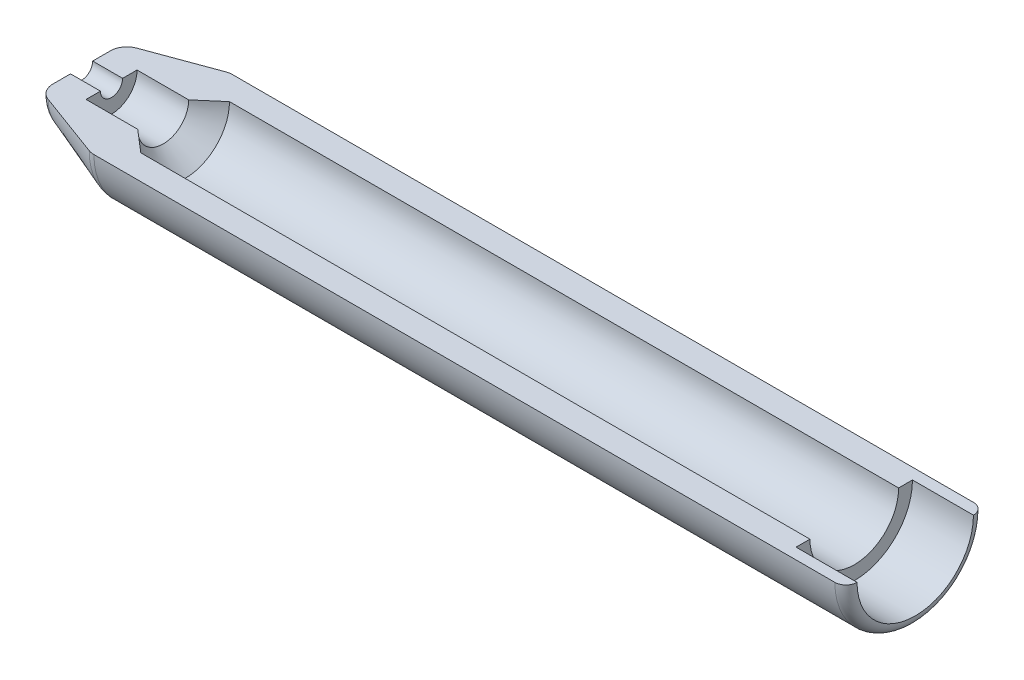
ISO-10303-21;
HEADER;
FILE_DESCRIPTION(('STEP AP214'),'2;1');
FILE_NAME('part.step','',(''),(''),'','','');
FILE_SCHEMA(('AUTOMOTIVE_DESIGN { 1 0 10303 214 1 1 1 1 }'));
ENDSEC;
DATA;
#1=APPLICATION_CONTEXT('core data for automotive mechanical design processes');
#2=APPLICATION_PROTOCOL_DEFINITION('international standard','automotive_design',2000,#1);
#3=PRODUCT_CONTEXT('',#1,'mechanical');
#4=PRODUCT('Part','Part','',(#3));
#5=PRODUCT_RELATED_PRODUCT_CATEGORY('part','',(#4));
#6=PRODUCT_DEFINITION_FORMATION('','',#4);
#7=PRODUCT_DEFINITION_CONTEXT('part definition',#1,'design');
#8=PRODUCT_DEFINITION('design','',#6,#7);
#9=PRODUCT_DEFINITION_SHAPE('','',#8);
#10=(LENGTH_UNIT() NAMED_UNIT(*) SI_UNIT(.MILLI.,.METRE.));
#11=(NAMED_UNIT(*) PLANE_ANGLE_UNIT() SI_UNIT($,.RADIAN.));
#12=(NAMED_UNIT(*) SI_UNIT($,.STERADIAN.) SOLID_ANGLE_UNIT());
#13=UNCERTAINTY_MEASURE_WITH_UNIT(LENGTH_MEASURE(1.E-05),#10,'distance_accuracy_value','');
#14=(GEOMETRIC_REPRESENTATION_CONTEXT(3) GLOBAL_UNCERTAINTY_ASSIGNED_CONTEXT((#13)) GLOBAL_UNIT_ASSIGNED_CONTEXT((#10,
#11,#12)) REPRESENTATION_CONTEXT('',''));
#15=CARTESIAN_POINT('',(0.,0.,0.));
#16=DIRECTION('',(0.,0.,1.));
#17=DIRECTION('',(1.,0.,0.));
#18=AXIS2_PLACEMENT_3D('',#15,#16,#17);
#19=CARTESIAN_POINT('',(-2.32246740661106,0.,-0.100000000000268));
#20=DIRECTION('',(1.,0.,0.));
#21=DIRECTION('',(0.,0.,-1.));
#22=AXIS2_PLACEMENT_3D('',#19,#20,#21);
#23=TOROIDAL_SURFACE('',#22,0.518463927586876,0.3);
#24=CARTESIAN_POINT('',(-2.62246740661106,0.,-0.100000000000268));
#25=DIRECTION('',(1.,0.,0.));
#26=DIRECTION('',(0.,0.,-1.));
#27=AXIS2_PLACEMENT_3D('',#24,#25,#26);
#28=CIRCLE('',#27,0.518463927586876);
#29=CARTESIAN_POINT('',(-2.62246740661106,0.,0.418463927586608));
#30=VERTEX_POINT('',#29);
#31=CARTESIAN_POINT('',(-2.62246740661106,0.,-0.618463927587144));
#32=VERTEX_POINT('',#31);
#33=EDGE_CURVE('E11',#30,#32,#28,.T.);
#34=ORIENTED_EDGE('',*,*,#33,.T.);
#35=CARTESIAN_POINT('',(-2.32246740661106,0.,-0.618463927587144));
#36=DIRECTION('',(0.,1.,0.));
#37=DIRECTION('',(0.,0.,1.));
#38=AXIS2_PLACEMENT_3D('',#35,#36,#37);
#39=CIRCLE('',#38,0.3);
#40=CARTESIAN_POINT('',(-2.42608902564006,0.,-0.900000000000268));
#41=VERTEX_POINT('',#40);
#42=EDGE_CURVE('E126',#41,#32,#39,.T.);
#43=ORIENTED_EDGE('',*,*,#42,.F.);
#44=CARTESIAN_POINT('',(-2.42608902564006,0.,-0.100000000000268));
#45=DIRECTION('',(1.,0.,0.));
#46=DIRECTION('',(0.,0.,-1.));
#47=AXIS2_PLACEMENT_3D('',#44,#45,#46);
#48=CIRCLE('',#47,0.8);
#49=CARTESIAN_POINT('',(-2.42608902564006,0.,0.699999999999732));
#50=VERTEX_POINT('',#49);
#51=EDGE_CURVE('E47',#50,#41,#48,.T.);
#52=ORIENTED_EDGE('',*,*,#51,.F.);
#53=CARTESIAN_POINT('',(-2.32246740661106,0.,0.418463927586608));
#54=DIRECTION('',(0.,-1.,0.));
#55=DIRECTION('',(0.,0.,-1.));
#56=AXIS2_PLACEMENT_3D('',#53,#54,#55);
#57=CIRCLE('',#56,0.3);
#58=EDGE_CURVE('E128',#50,#30,#57,.T.);
#59=ORIENTED_EDGE('',*,*,#58,.T.);
#60=EDGE_LOOP('',(#34,#43,#52,#59));
#61=FACE_BOUND('',#60,.T.);
#62=ADVANCED_FACE('F32',(#61),#23,.T.);
#63=CARTESIAN_POINT('',(-2.62246740661106,0.,0.418463927586608));
#64=DIRECTION('',(-1.,0.,0.));
#65=DIRECTION('',(0.,0.,1.));
#66=AXIS2_PLACEMENT_3D('',#63,#64,#65);
#67=PLANE('',#66);
#68=CARTESIAN_POINT('',(-2.62246740661106,0.,-0.100000000000268));
#69=DIRECTION('',(1.,0.,0.));
#70=DIRECTION('',(0.,0.,-1.));
#71=AXIS2_PLACEMENT_3D('',#68,#69,#70);
#72=CIRCLE('',#71,0.2);
#73=CARTESIAN_POINT('',(-2.62246740661106,0.,0.099999999999732));
#74=VERTEX_POINT('',#73);
#75=CARTESIAN_POINT('',(-2.62246740661106,0.,-0.300000000000268));
#76=VERTEX_POINT('',#75);
#77=EDGE_CURVE('E40',#74,#76,#72,.T.);
#78=ORIENTED_EDGE('',*,*,#77,.T.);
#79=DIRECTION('',(0.,0.,1.));
#80=VECTOR('',#79,1.);
#81=CARTESIAN_POINT('',(-2.62246740661106,0.,-0.618463927587144));
#82=LINE('',#81,#80);
#83=EDGE_CURVE('E137',#32,#76,#82,.T.);
#84=ORIENTED_EDGE('',*,*,#83,.F.);
#85=ORIENTED_EDGE('',*,*,#33,.F.);
#86=DIRECTION('',(0.,0.,-1.));
#87=VECTOR('',#86,1.);
#88=CARTESIAN_POINT('',(-2.62246740661106,0.,0.418463927586608));
#89=LINE('',#88,#87);
#90=EDGE_CURVE('E173',#30,#74,#89,.T.);
#91=ORIENTED_EDGE('',*,*,#90,.T.);
#92=EDGE_LOOP('',(#78,#84,#85,#91));
#93=FACE_BOUND('',#92,.T.);
#94=ADVANCED_FACE('F34',(#93),#67,.T.);
#95=CARTESIAN_POINT('',(-3.18503295530929,0.,-0.100000000000268));
#96=DIRECTION('',(1.,0.,0.));
#97=DIRECTION('',(0.,0.,-1.));
#98=AXIS2_PLACEMENT_3D('',#95,#96,#97);
#99=CYLINDRICAL_SURFACE('',#98,0.2);
#100=CARTESIAN_POINT('',(-2.08239037192044,0.,-0.100000000000268));
#101=DIRECTION('',(1.,0.,0.));
#102=DIRECTION('',(0.,0.,-1.));
#103=AXIS2_PLACEMENT_3D('',#100,#101,#102);
#104=CIRCLE('',#103,0.2);
#105=CARTESIAN_POINT('',(-2.08239037192044,0.,0.099999999999732));
#106=VERTEX_POINT('',#105);
#107=CARTESIAN_POINT('',(-2.08239037192044,0.,-0.300000000000268));
#108=VERTEX_POINT('',#107);
#109=EDGE_CURVE('E224',#106,#108,#104,.T.);
#110=ORIENTED_EDGE('',*,*,#109,.T.);
#111=DIRECTION('',(1.,0.,0.));
#112=VECTOR('',#111,1.);
#113=CARTESIAN_POINT('',(-2.08239037192044,0.,-0.300000000000268));
#114=LINE('',#113,#112);
#115=EDGE_CURVE('E142',#76,#108,#114,.T.);
#116=ORIENTED_EDGE('',*,*,#115,.F.);
#117=ORIENTED_EDGE('',*,*,#77,.F.);
#118=DIRECTION('',(1.,0.,0.));
#119=VECTOR('',#118,1.);
#120=CARTESIAN_POINT('',(-2.08239037192044,0.,0.099999999999732));
#121=LINE('',#120,#119);
#122=EDGE_CURVE('E175',#74,#106,#121,.T.);
#123=ORIENTED_EDGE('',*,*,#122,.T.);
#124=EDGE_LOOP('',(#110,#116,#117,#123));
#125=FACE_BOUND('',#124,.T.);
#126=ADVANCED_FACE('F226',(#125),#99,.F.);
#127=CARTESIAN_POINT('',(-2.08239037192044,0.,0.099999999999732));
#128=DIRECTION('',(1.,0.,0.));
#129=DIRECTION('',(0.,0.,-1.));
#130=AXIS2_PLACEMENT_3D('',#127,#128,#129);
#131=PLANE('',#130);
#132=CARTESIAN_POINT('',(-2.08239037192044,0.,-0.100000000000268));
#133=DIRECTION('',(1.,0.,0.));
#134=DIRECTION('',(0.,0.,-1.));
#135=AXIS2_PLACEMENT_3D('',#132,#133,#134);
#136=CIRCLE('',#135,0.46);
#137=CARTESIAN_POINT('',(-2.08239037192044,0.,0.359999999999732));
#138=VERTEX_POINT('',#137);
#139=CARTESIAN_POINT('',(-2.08239037192044,0.,-0.560000000000268));
#140=VERTEX_POINT('',#139);
#141=EDGE_CURVE('E222',#138,#140,#136,.T.);
#142=ORIENTED_EDGE('',*,*,#141,.T.);
#143=DIRECTION('',(0.,0.,-1.));
#144=VECTOR('',#143,1.);
#145=CARTESIAN_POINT('',(-2.08239037192044,0.,-0.300000000000268));
#146=LINE('',#145,#144);
#147=EDGE_CURVE('E144',#108,#140,#146,.T.);
#148=ORIENTED_EDGE('',*,*,#147,.F.);
#149=ORIENTED_EDGE('',*,*,#109,.F.);
#150=DIRECTION('',(0.,0.,1.));
#151=VECTOR('',#150,1.);
#152=CARTESIAN_POINT('',(-2.08239037192044,0.,0.099999999999732));
#153=LINE('',#152,#151);
#154=EDGE_CURVE('E178',#106,#138,#153,.T.);
#155=ORIENTED_EDGE('',*,*,#154,.T.);
#156=EDGE_LOOP('',(#142,#148,#149,#155));
#157=FACE_BOUND('',#156,.T.);
#158=ADVANCED_FACE('F232',(#157),#131,.T.);
#159=CARTESIAN_POINT('',(-3.18503295530929,0.,-0.100000000000268));
#160=DIRECTION('',(1.,0.,0.));
#161=DIRECTION('',(0.,0.,-1.));
#162=AXIS2_PLACEMENT_3D('',#159,#160,#161);
#163=CYLINDRICAL_SURFACE('',#162,0.46);
#164=CARTESIAN_POINT('',(-1.15,0.,-0.100000000000268));
#165=DIRECTION('',(1.,0.,0.));
#166=DIRECTION('',(0.,0.,-1.));
#167=AXIS2_PLACEMENT_3D('',#164,#165,#166);
#168=CIRCLE('',#167,0.46);
#169=CARTESIAN_POINT('',(-1.15,0.,0.359999999999732));
#170=VERTEX_POINT('',#169);
#171=CARTESIAN_POINT('',(-1.15,0.,-0.560000000000268));
#172=VERTEX_POINT('',#171);
#173=EDGE_CURVE('E220',#170,#172,#168,.T.);
#174=ORIENTED_EDGE('',*,*,#173,.T.);
#175=DIRECTION('',(1.,0.,0.));
#176=VECTOR('',#175,1.);
#177=CARTESIAN_POINT('',(-2.08239037192044,0.,-0.560000000000268));
#178=LINE('',#177,#176);
#179=EDGE_CURVE('E149',#140,#172,#178,.T.);
#180=ORIENTED_EDGE('',*,*,#179,.F.);
#181=ORIENTED_EDGE('',*,*,#141,.F.);
#182=DIRECTION('',(1.,0.,0.));
#183=VECTOR('',#182,1.);
#184=CARTESIAN_POINT('',(-2.08239037192044,0.,0.359999999999732));
#185=LINE('',#184,#183);
#186=EDGE_CURVE('E181',#138,#170,#185,.T.);
#187=ORIENTED_EDGE('',*,*,#186,.T.);
#188=EDGE_LOOP('',(#174,#180,#181,#187));
#189=FACE_BOUND('',#188,.T.);
#190=ADVANCED_FACE('F235',(#189),#163,.F.);
#191=CARTESIAN_POINT('',(-1.15,0.,-0.100000000000268));
#192=DIRECTION('',(1.,0.,0.));
#193=DIRECTION('',(0.,0.,-1.));
#194=AXIS2_PLACEMENT_3D('',#191,#192,#193);
#195=CONICAL_SURFACE('',#194,0.46,0.710018612411804);
#196=CARTESIAN_POINT('',(-0.754449261183806,0.,-0.100000000000268));
#197=DIRECTION('',(1.,0.,0.));
#198=DIRECTION('',(0.,0.,-1.));
#199=AXIS2_PLACEMENT_3D('',#196,#197,#198);
#200=CIRCLE('',#199,0.8);
#201=CARTESIAN_POINT('',(-0.754449261183806,0.,0.699999999999733));
#202=VERTEX_POINT('',#201);
#203=CARTESIAN_POINT('',(-0.754449261183806,0.,-0.900000000000268));
#204=VERTEX_POINT('',#203);
#205=EDGE_CURVE('E218',#202,#204,#200,.T.);
#206=ORIENTED_EDGE('',*,*,#205,.T.);
#207=DIRECTION('',(0.758349743660579,0.,-0.651847885852163));
#208=VECTOR('',#207,1.);
#209=CARTESIAN_POINT('',(-1.15,0.,-0.560000000000268));
#210=LINE('',#209,#208);
#211=EDGE_CURVE('E152',#172,#204,#210,.T.);
#212=ORIENTED_EDGE('',*,*,#211,.F.);
#213=ORIENTED_EDGE('',*,*,#173,.F.);
#214=DIRECTION('',(0.758349743660579,0.,0.651847885852163));
#215=VECTOR('',#214,1.);
#216=CARTESIAN_POINT('',(-1.15,0.,0.359999999999732));
#217=LINE('',#216,#215);
#218=EDGE_CURVE('E184',#170,#202,#217,.T.);
#219=ORIENTED_EDGE('',*,*,#218,.T.);
#220=EDGE_LOOP('',(#206,#212,#213,#219));
#221=FACE_BOUND('',#220,.T.);
#222=ADVANCED_FACE('F240',(#221),#195,.F.);
#223=CARTESIAN_POINT('',(-3.18503295530929,0.,-0.100000000000268));
#224=DIRECTION('',(1.,0.,0.));
#225=DIRECTION('',(0.,0.,-1.));
#226=AXIS2_PLACEMENT_3D('',#223,#224,#225);
#227=CYLINDRICAL_SURFACE('',#226,0.800000000000001);
#228=CARTESIAN_POINT('',(11.3176096280796,0.,-0.100000000000268));
#229=DIRECTION('',(1.,0.,0.));
#230=DIRECTION('',(0.,0.,-1.));
#231=AXIS2_PLACEMENT_3D('',#228,#229,#230);
#232=CIRCLE('',#231,0.800000000000001);
#233=CARTESIAN_POINT('',(11.3176096280796,0.,0.699999999999733));
#234=VERTEX_POINT('',#233);
#235=CARTESIAN_POINT('',(11.3176096280796,0.,-0.900000000000269));
#236=VERTEX_POINT('',#235);
#237=EDGE_CURVE('E215',#234,#236,#232,.T.);
#238=ORIENTED_EDGE('',*,*,#237,.T.);
#239=DIRECTION('',(1.,0.,0.));
#240=VECTOR('',#239,1.);
#241=CARTESIAN_POINT('',(-0.754449261183806,0.,-0.900000000000268));
#242=LINE('',#241,#240);
#243=EDGE_CURVE('E155',#204,#236,#242,.T.);
#244=ORIENTED_EDGE('',*,*,#243,.F.);
#245=ORIENTED_EDGE('',*,*,#205,.F.);
#246=DIRECTION('',(1.,0.,0.));
#247=VECTOR('',#246,1.);
#248=CARTESIAN_POINT('',(-0.754449261183806,0.,0.699999999999733));
#249=LINE('',#248,#247);
#250=EDGE_CURVE('E187',#202,#234,#249,.T.);
#251=ORIENTED_EDGE('',*,*,#250,.T.);
#252=EDGE_LOOP('',(#238,#244,#245,#251));
#253=FACE_BOUND('',#252,.T.);
#254=ADVANCED_FACE('F243',(#253),#227,.F.);
#255=CARTESIAN_POINT('',(11.3176096280796,0.,0.949999999999733));
#256=DIRECTION('',(1.,0.,0.));
#257=DIRECTION('',(0.,0.,-1.));
#258=AXIS2_PLACEMENT_3D('',#255,#256,#257);
#259=PLANE('',#258);
#260=CARTESIAN_POINT('',(11.3176096280796,0.,-0.100000000000268));
#261=DIRECTION('',(1.,0.,0.));
#262=DIRECTION('',(0.,0.,-1.));
#263=AXIS2_PLACEMENT_3D('',#260,#261,#262);
#264=CIRCLE('',#263,1.05);
#265=CARTESIAN_POINT('',(11.3176096280796,0.,0.949999999999733));
#266=VERTEX_POINT('',#265);
#267=CARTESIAN_POINT('',(11.3176096280796,0.,-1.15000000000027));
#268=VERTEX_POINT('',#267);
#269=EDGE_CURVE('E213',#266,#268,#264,.T.);
#270=ORIENTED_EDGE('',*,*,#269,.T.);
#271=DIRECTION('',(0.,0.,-1.));
#272=VECTOR('',#271,1.);
#273=CARTESIAN_POINT('',(11.3176096280796,0.,-1.15000000000027));
#274=LINE('',#273,#272);
#275=EDGE_CURVE('E157',#236,#268,#274,.T.);
#276=ORIENTED_EDGE('',*,*,#275,.F.);
#277=ORIENTED_EDGE('',*,*,#237,.F.);
#278=DIRECTION('',(0.,0.,1.));
#279=VECTOR('',#278,1.);
#280=CARTESIAN_POINT('',(11.3176096280796,0.,0.949999999999733));
#281=LINE('',#280,#279);
#282=EDGE_CURVE('E189',#234,#266,#281,.T.);
#283=ORIENTED_EDGE('',*,*,#282,.T.);
#284=EDGE_LOOP('',(#270,#276,#277,#283));
#285=FACE_BOUND('',#284,.T.);
#286=ADVANCED_FACE('F268',(#285),#259,.T.);
#287=CARTESIAN_POINT('',(-3.18503295530929,0.,-0.100000000000268));
#288=DIRECTION('',(1.,0.,0.));
#289=DIRECTION('',(0.,0.,-1.));
#290=AXIS2_PLACEMENT_3D('',#287,#288,#289);
#291=CYLINDRICAL_SURFACE('',#290,1.05);
#292=CARTESIAN_POINT('',(12.4176096280796,0.,-0.100000000000268));
#293=DIRECTION('',(1.,0.,0.));
#294=DIRECTION('',(0.,0.,-1.));
#295=AXIS2_PLACEMENT_3D('',#292,#293,#294);
#296=CIRCLE('',#295,1.05);
#297=CARTESIAN_POINT('',(12.4176096280796,0.,0.949999999999733));
#298=VERTEX_POINT('',#297);
#299=CARTESIAN_POINT('',(12.4176096280796,0.,-1.15000000000027));
#300=VERTEX_POINT('',#299);
#301=EDGE_CURVE('E211',#298,#300,#296,.T.);
#302=ORIENTED_EDGE('',*,*,#301,.T.);
#303=DIRECTION('',(1.,0.,0.));
#304=VECTOR('',#303,1.);
#305=CARTESIAN_POINT('',(12.4176096280796,0.,-1.15000000000027));
#306=LINE('',#305,#304);
#307=EDGE_CURVE('E160',#268,#300,#306,.T.);
#308=ORIENTED_EDGE('',*,*,#307,.F.);
#309=ORIENTED_EDGE('',*,*,#269,.F.);
#310=DIRECTION('',(1.,0.,0.));
#311=VECTOR('',#310,1.);
#312=CARTESIAN_POINT('',(12.4176096280796,0.,0.949999999999733));
#313=LINE('',#312,#311);
#314=EDGE_CURVE('E192',#266,#298,#313,.T.);
#315=ORIENTED_EDGE('',*,*,#314,.T.);
#316=EDGE_LOOP('',(#302,#308,#309,#315));
#317=FACE_BOUND('',#316,.T.);
#318=ADVANCED_FACE('F250',(#317),#291,.F.);
#319=CARTESIAN_POINT('',(12.2176096280796,0.,-0.100000000000268));
#320=DIRECTION('',(1.,0.,0.));
#321=DIRECTION('',(0.,0.,-1.));
#322=AXIS2_PLACEMENT_3D('',#319,#320,#321);
#323=TOROIDAL_SURFACE('',#322,1.05,0.2);
#324=CARTESIAN_POINT('',(12.2176096280796,0.,-0.100000000000268));
#325=DIRECTION('',(1.,0.,0.));
#326=DIRECTION('',(0.,0.,-1.));
#327=AXIS2_PLACEMENT_3D('',#324,#325,#326);
#328=CIRCLE('',#327,1.25);
#329=CARTESIAN_POINT('',(12.2176096280796,0.,1.14999999999973));
#330=VERTEX_POINT('',#329);
#331=CARTESIAN_POINT('',(12.2176096280796,0.,-1.35000000000027));
#332=VERTEX_POINT('',#331);
#333=EDGE_CURVE('E209',#330,#332,#328,.T.);
#334=ORIENTED_EDGE('',*,*,#333,.T.);
#335=CARTESIAN_POINT('',(12.2176096280796,0.,-1.15000000000027));
#336=DIRECTION('',(0.,1.,0.));
#337=DIRECTION('',(0.,0.,-1.));
#338=AXIS2_PLACEMENT_3D('',#335,#336,#337);
#339=CIRCLE('',#338,0.2);
#340=EDGE_CURVE('E163',#300,#332,#339,.T.);
#341=ORIENTED_EDGE('',*,*,#340,.F.);
#342=ORIENTED_EDGE('',*,*,#301,.F.);
#343=CARTESIAN_POINT('',(12.2176096280796,0.,0.949999999999732));
#344=DIRECTION('',(0.,-1.,0.));
#345=DIRECTION('',(0.,0.,1.));
#346=AXIS2_PLACEMENT_3D('',#343,#344,#345);
#347=CIRCLE('',#346,0.2);
#348=EDGE_CURVE('E195',#298,#330,#347,.T.);
#349=ORIENTED_EDGE('',*,*,#348,.T.);
#350=EDGE_LOOP('',(#334,#341,#342,#349));
#351=FACE_BOUND('',#350,.T.);
#352=ADVANCED_FACE('F254',(#351),#323,.T.);
#353=CARTESIAN_POINT('',(-3.18503295530929,0.,-0.100000000000268));
#354=DIRECTION('',(1.,0.,0.));
#355=DIRECTION('',(0.,0.,-1.));
#356=AXIS2_PLACEMENT_3D('',#353,#354,#355);
#357=CYLINDRICAL_SURFACE('',#356,1.25);
#358=CARTESIAN_POINT('',(-1.15,0.,-0.100000000000268));
#359=DIRECTION('',(1.,0.,0.));
#360=DIRECTION('',(0.,0.,-1.));
#361=AXIS2_PLACEMENT_3D('',#358,#359,#360);
#362=CIRCLE('',#361,1.25);
#363=CARTESIAN_POINT('',(-1.15,0.,1.14999999999973));
#364=VERTEX_POINT('',#363);
#365=CARTESIAN_POINT('',(-1.15,0.,-1.35000000000027));
#366=VERTEX_POINT('',#365);
#367=EDGE_CURVE('E207',#364,#366,#362,.T.);
#368=ORIENTED_EDGE('',*,*,#367,.T.);
#369=DIRECTION('',(-1.,0.,0.));
#370=VECTOR('',#369,1.);
#371=CARTESIAN_POINT('',(12.2176096280796,0.,-1.35000000000027));
#372=LINE('',#371,#370);
#373=EDGE_CURVE('E166',#332,#366,#372,.T.);
#374=ORIENTED_EDGE('',*,*,#373,.F.);
#375=ORIENTED_EDGE('',*,*,#333,.F.);
#376=DIRECTION('',(-1.,0.,0.));
#377=VECTOR('',#376,1.);
#378=CARTESIAN_POINT('',(12.2176096280796,0.,1.14999999999973));
#379=LINE('',#378,#377);
#380=EDGE_CURVE('E198',#330,#364,#379,.T.);
#381=ORIENTED_EDGE('',*,*,#380,.T.);
#382=EDGE_LOOP('',(#368,#374,#375,#381));
#383=FACE_BOUND('',#382,.T.);
#384=ADVANCED_FACE('F259',(#383),#357,.T.);
#385=CARTESIAN_POINT('',(-1.15,0.,-0.100000000000268));
#386=DIRECTION('',(1.,0.,0.));
#387=DIRECTION('',(0.,0.,-1.));
#388=AXIS2_PLACEMENT_3D('',#385,#386,#387);
#389=TOROIDAL_SURFACE('',#388,0.949999999999999,0.3);
#390=CARTESIAN_POINT('',(-1.25362161902901,0.,-0.100000000000268));
#391=DIRECTION('',(1.,0.,0.));
#392=DIRECTION('',(0.,0.,-1.));
#393=AXIS2_PLACEMENT_3D('',#390,#391,#392);
#394=CIRCLE('',#393,1.23153607241312);
#395=CARTESIAN_POINT('',(-1.25362161902901,0.,1.13153607241285));
#396=VERTEX_POINT('',#395);
#397=CARTESIAN_POINT('',(-1.25362161902901,0.,-1.33153607241339));
#398=VERTEX_POINT('',#397);
#399=EDGE_CURVE('E55',#396,#398,#394,.T.);
#400=ORIENTED_EDGE('',*,*,#399,.T.);
#401=CARTESIAN_POINT('',(-1.15,0.,-1.05000000000027));
#402=DIRECTION('',(0.,1.,0.));
#403=DIRECTION('',(0.,0.,-1.));
#404=AXIS2_PLACEMENT_3D('',#401,#402,#403);
#405=CIRCLE('',#404,0.3);
#406=EDGE_CURVE('E169',#366,#398,#405,.T.);
#407=ORIENTED_EDGE('',*,*,#406,.F.);
#408=ORIENTED_EDGE('',*,*,#367,.F.);
#409=CARTESIAN_POINT('',(-1.15,0.,0.849999999999731));
#410=DIRECTION('',(0.,-1.,0.));
#411=DIRECTION('',(0.,0.,1.));
#412=AXIS2_PLACEMENT_3D('',#409,#410,#411);
#413=CIRCLE('',#412,0.3);
#414=EDGE_CURVE('E201',#364,#396,#413,.T.);
#415=ORIENTED_EDGE('',*,*,#414,.T.);
#416=EDGE_LOOP('',(#400,#407,#408,#415));
#417=FACE_BOUND('',#416,.T.);
#418=ADVANCED_FACE('F262',(#417),#389,.T.);
#419=CARTESIAN_POINT('',(-1.25362161902901,0.,-0.100000000000268));
#420=DIRECTION('',(1.,0.,0.));
#421=DIRECTION('',(0.,0.,-1.));
#422=AXIS2_PLACEMENT_3D('',#419,#420,#421);
#423=CONICAL_SURFACE('',#422,1.23153607241312,0.35267073459776);
#424=DIRECTION('',(-0.938453574710413,0.,-0.345405396763349));
#425=VECTOR('',#424,1.);
#426=CARTESIAN_POINT('',(-2.42608902564006,0.,0.699999999999732));
#427=LINE('',#426,#425);
#428=EDGE_CURVE('E203',#396,#50,#427,.T.);
#429=ORIENTED_EDGE('',*,*,#428,.T.);
#430=ORIENTED_EDGE('',*,*,#51,.T.);
#431=DIRECTION('',(-0.938453574710413,0.,0.345405396763349));
#432=VECTOR('',#431,1.);
#433=CARTESIAN_POINT('',(-2.42608902564006,0.,-0.900000000000268));
#434=LINE('',#433,#432);
#435=EDGE_CURVE('E140',#398,#41,#434,.T.);
#436=ORIENTED_EDGE('',*,*,#435,.F.);
#437=ORIENTED_EDGE('',*,*,#399,.F.);
#438=EDGE_LOOP('',(#429,#430,#436,#437));
#439=FACE_BOUND('',#438,.T.);
#440=ADVANCED_FACE('F264',(#439),#423,.T.);
#441=CARTESIAN_POINT('',(-2.32246740661106,0.,0.418463927586608));
#442=DIRECTION('',(0.,-1.,0.));
#443=DIRECTION('',(0.,0.,-1.));
#444=AXIS2_PLACEMENT_3D('',#441,#442,#443);
#445=PLANE('',#444);
#446=ORIENTED_EDGE('',*,*,#58,.F.);
#447=ORIENTED_EDGE('',*,*,#428,.F.);
#448=ORIENTED_EDGE('',*,*,#414,.F.);
#449=ORIENTED_EDGE('',*,*,#380,.F.);
#450=ORIENTED_EDGE('',*,*,#348,.F.);
#451=ORIENTED_EDGE('',*,*,#314,.F.);
#452=ORIENTED_EDGE('',*,*,#282,.F.);
#453=ORIENTED_EDGE('',*,*,#250,.F.);
#454=ORIENTED_EDGE('',*,*,#218,.F.);
#455=ORIENTED_EDGE('',*,*,#186,.F.);
#456=ORIENTED_EDGE('',*,*,#154,.F.);
#457=ORIENTED_EDGE('',*,*,#122,.F.);
#458=ORIENTED_EDGE('',*,*,#90,.F.);
#459=EDGE_LOOP('',(#446,#447,#448,#449,#450,#451,#452,#453,#454,#455,#456,#457,#458));
#460=FACE_BOUND('',#459,.T.);
#461=ADVANCED_FACE('F266',(#460),#445,.F.);
#462=CARTESIAN_POINT('',(-2.32246740661106,0.,-0.618463927587144));
#463=DIRECTION('',(0.,1.,0.));
#464=DIRECTION('',(0.,0.,1.));
#465=AXIS2_PLACEMENT_3D('',#462,#463,#464);
#466=PLANE('',#465);
#467=ORIENTED_EDGE('',*,*,#42,.T.);
#468=ORIENTED_EDGE('',*,*,#83,.T.);
#469=ORIENTED_EDGE('',*,*,#115,.T.);
#470=ORIENTED_EDGE('',*,*,#147,.T.);
#471=ORIENTED_EDGE('',*,*,#179,.T.);
#472=ORIENTED_EDGE('',*,*,#211,.T.);
#473=ORIENTED_EDGE('',*,*,#243,.T.);
#474=ORIENTED_EDGE('',*,*,#275,.T.);
#475=ORIENTED_EDGE('',*,*,#307,.T.);
#476=ORIENTED_EDGE('',*,*,#340,.T.);
#477=ORIENTED_EDGE('',*,*,#373,.T.);
#478=ORIENTED_EDGE('',*,*,#406,.T.);
#479=ORIENTED_EDGE('',*,*,#435,.T.);
#480=EDGE_LOOP('',(#467,#468,#469,#470,#471,#472,#473,#474,#475,#476,#477,#478,#479));
#481=FACE_BOUND('',#480,.T.);
#482=ADVANCED_FACE('F135',(#481),#466,.T.);
#483=CLOSED_SHELL('',(#62,#94,#126,#158,#190,#222,#254,#286,#318,#352,#384,#418,#440,#461,#482));
#484=MANIFOLD_SOLID_BREP('B2',#483);
#485=ADVANCED_BREP_SHAPE_REPRESENTATION('',(#18,#484),#14);
#486=SHAPE_DEFINITION_REPRESENTATION(#9,#485);
ENDSEC;
END-ISO-10303-21;
